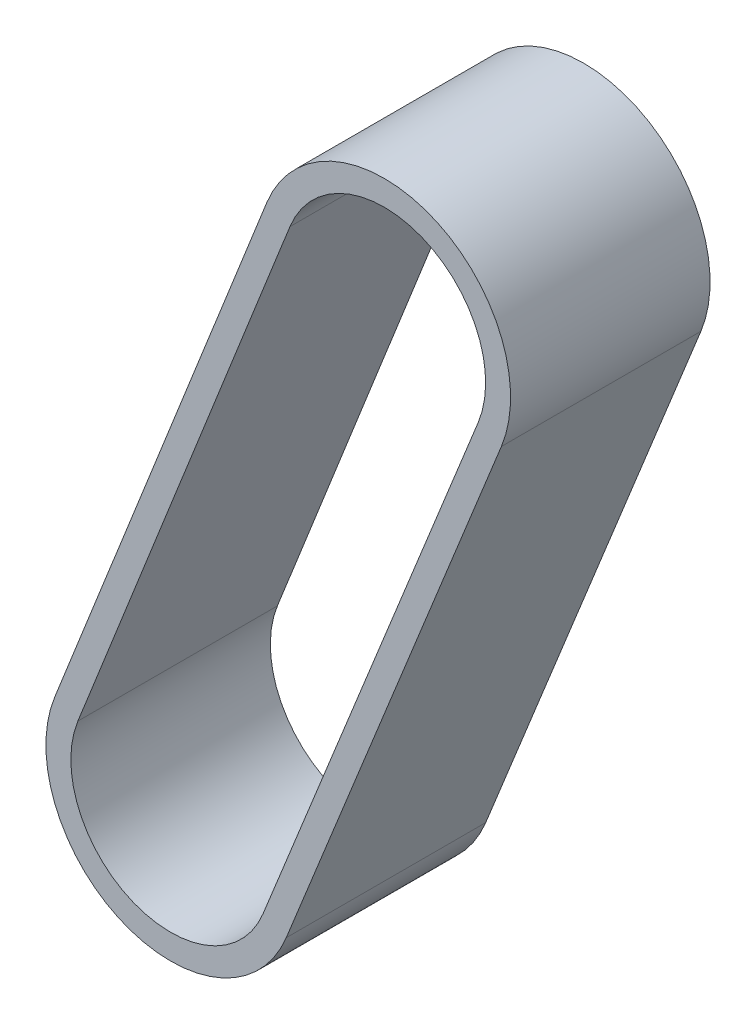
ISO-10303-21;
HEADER;
FILE_DESCRIPTION(('STEP AP214'),'2;1');
FILE_NAME('part.step','',(''),(''),'','','');
FILE_SCHEMA(('AUTOMOTIVE_DESIGN { 1 0 10303 214 1 1 1 1 }'));
ENDSEC;
DATA;
#1=APPLICATION_CONTEXT('core data for automotive mechanical design processes');
#2=APPLICATION_PROTOCOL_DEFINITION('international standard','automotive_design',2000,#1);
#3=PRODUCT_CONTEXT('',#1,'mechanical');
#4=PRODUCT('Part','Part','',(#3));
#5=PRODUCT_RELATED_PRODUCT_CATEGORY('part','',(#4));
#6=PRODUCT_DEFINITION_FORMATION('','',#4);
#7=PRODUCT_DEFINITION_CONTEXT('part definition',#1,'design');
#8=PRODUCT_DEFINITION('design','',#6,#7);
#9=PRODUCT_DEFINITION_SHAPE('','',#8);
#10=(LENGTH_UNIT() NAMED_UNIT(*) SI_UNIT(.MILLI.,.METRE.));
#11=(NAMED_UNIT(*) PLANE_ANGLE_UNIT() SI_UNIT($,.RADIAN.));
#12=(NAMED_UNIT(*) SI_UNIT($,.STERADIAN.) SOLID_ANGLE_UNIT());
#13=UNCERTAINTY_MEASURE_WITH_UNIT(LENGTH_MEASURE(1.E-05),#10,'distance_accuracy_value','');
#14=(GEOMETRIC_REPRESENTATION_CONTEXT(3) GLOBAL_UNCERTAINTY_ASSIGNED_CONTEXT((#13)) GLOBAL_UNIT_ASSIGNED_CONTEXT((#10,
#11,#12)) REPRESENTATION_CONTEXT('',''));
#15=CARTESIAN_POINT('',(0.,0.,0.));
#16=DIRECTION('',(0.,0.,1.));
#17=DIRECTION('',(1.,0.,0.));
#18=AXIS2_PLACEMENT_3D('',#15,#16,#17);
#19=CARTESIAN_POINT('',(-312.556104691908,126.162932863253,-3.00000000000024));
#20=DIRECTION('',(0.927305329792492,-0.374305791216805,0.));
#21=DIRECTION('',(0.374305791216805,0.927305329792492,0.));
#22=AXIS2_PLACEMENT_3D('',#19,#20,#21);
#23=PLANE('',#22);
#24=DIRECTION('',(0.374305791216805,0.927305329792492,0.));
#25=VECTOR('',#24,1.);
#26=CARTESIAN_POINT('',(-312.556104691908,126.162932863253,8.99999999999976));
#27=LINE('',#26,#25);
#28=CARTESIAN_POINT('',(-366.794500886047,-8.2072934341261,8.99999999999976));
#29=VERTEX_POINT('',#28);
#30=CARTESIAN_POINT('',(-353.852479493577,23.8552759867522,8.99999999999976));
#31=VERTEX_POINT('',#30);
#32=EDGE_CURVE('E144',#29,#31,#27,.T.);
#33=ORIENTED_EDGE('',*,*,#32,.F.);
#34=DIRECTION('',(0.,0.,1.));
#35=VECTOR('',#34,1.);
#36=CARTESIAN_POINT('',(-366.794500886047,-8.2072934341261,-3.00000000000024));
#37=LINE('',#36,#35);
#38=CARTESIAN_POINT('',(-366.794500886047,-8.2072934341261,-3.00000000000024));
#39=VERTEX_POINT('',#38);
#40=EDGE_CURVE('E11',#39,#29,#37,.T.);
#41=ORIENTED_EDGE('',*,*,#40,.F.);
#42=DIRECTION('',(0.374305791216805,0.927305329792492,0.));
#43=VECTOR('',#42,1.);
#44=CARTESIAN_POINT('',(-312.556104691908,126.162932863253,-3.00000000000024));
#45=LINE('',#44,#43);
#46=CARTESIAN_POINT('',(-353.852479493577,23.8552759867522,-3.00000000000024));
#47=VERTEX_POINT('',#46);
#48=EDGE_CURVE('E128',#39,#47,#45,.T.);
#49=ORIENTED_EDGE('',*,*,#48,.T.);
#50=DIRECTION('',(0.,0.,1.));
#51=VECTOR('',#50,1.);
#52=CARTESIAN_POINT('',(-353.852479493577,23.8552759867522,-3.00000000000024));
#53=LINE('',#52,#51);
#54=EDGE_CURVE('E119',#47,#31,#53,.T.);
#55=ORIENTED_EDGE('',*,*,#54,.T.);
#56=EDGE_LOOP('',(#33,#41,#49,#55));
#57=FACE_BOUND('',#56,.T.);
#58=ADVANCED_FACE('F38',(#57),#23,.T.);
#59=CARTESIAN_POINT('',(-373.74929085949,-5.40000000000007,-3.00000000000024));
#60=DIRECTION('',(0.,0.,1.));
#61=DIRECTION('',(1.,0.,0.));
#62=AXIS2_PLACEMENT_3D('',#59,#60,#61);
#63=CYLINDRICAL_SURFACE('',#62,7.50000000000001);
#64=CARTESIAN_POINT('',(-373.74929085949,-5.40000000000007,8.99999999999976));
#65=DIRECTION('',(0.,0.,1.));
#66=DIRECTION('',(1.,0.,0.));
#67=AXIS2_PLACEMENT_3D('',#64,#65,#66);
#68=CIRCLE('',#67,7.50000000000001);
#69=CARTESIAN_POINT('',(-380.720202711763,-2.63298212007113,8.99999999999976));
#70=VERTEX_POINT('',#69);
#71=EDGE_CURVE('E150',#70,#29,#68,.T.);
#72=ORIENTED_EDGE('',*,*,#71,.F.);
#73=DIRECTION('',(0.,0.,1.));
#74=VECTOR('',#73,1.);
#75=CARTESIAN_POINT('',(-380.720202711763,-2.63298212007113,-3.00000000000024));
#76=LINE('',#75,#74);
#77=CARTESIAN_POINT('',(-380.720202711763,-2.63298212007113,-3.00000000000024));
#78=VERTEX_POINT('',#77);
#79=EDGE_CURVE('E48',#78,#70,#76,.T.);
#80=ORIENTED_EDGE('',*,*,#79,.F.);
#81=CARTESIAN_POINT('',(-373.74929085949,-5.40000000000007,-3.00000000000024));
#82=DIRECTION('',(0.,0.,1.));
#83=DIRECTION('',(1.,0.,0.));
#84=AXIS2_PLACEMENT_3D('',#81,#82,#83);
#85=CIRCLE('',#84,7.50000000000001);
#86=EDGE_CURVE('E125',#78,#39,#85,.T.);
#87=ORIENTED_EDGE('',*,*,#86,.T.);
#88=ORIENTED_EDGE('',*,*,#40,.T.);
#89=EDGE_LOOP('',(#72,#80,#87,#88));
#90=FACE_BOUND('',#89,.T.);
#91=ADVANCED_FACE('F194',(#90),#63,.T.);
#92=CARTESIAN_POINT('',(-327.996145648299,130.194043303065,-3.00000000000024));
#93=DIRECTION('',(-0.929454913636337,0.368935717323858,0.));
#94=DIRECTION('',(-0.368935717323858,-0.929454913636337,0.));
#95=AXIS2_PLACEMENT_3D('',#92,#93,#94);
#96=PLANE('',#95);
#97=DIRECTION('',(-0.368935717323858,-0.929454913636337,0.));
#98=VECTOR('',#97,1.);
#99=CARTESIAN_POINT('',(-327.996145648299,130.194043303065,8.99999999999976));
#100=LINE('',#99,#98);
#101=CARTESIAN_POINT('',(-367.963857343636,29.5039114516613,8.99999999999976));
#102=VERTEX_POINT('',#101);
#103=EDGE_CURVE('E114',#102,#70,#100,.T.);
#104=ORIENTED_EDGE('',*,*,#103,.F.);
#105=DIRECTION('',(0.,0.,1.));
#106=VECTOR('',#105,1.);
#107=CARTESIAN_POINT('',(-367.963857343636,29.5039114516613,-3.00000000000024));
#108=LINE('',#107,#106);
#109=CARTESIAN_POINT('',(-367.963857343636,29.5039114516613,-3.00000000000024));
#110=VERTEX_POINT('',#109);
#111=EDGE_CURVE('E109',#110,#102,#108,.T.);
#112=ORIENTED_EDGE('',*,*,#111,.F.);
#113=DIRECTION('',(-0.368935717323858,-0.929454913636337,0.));
#114=VECTOR('',#113,1.);
#115=CARTESIAN_POINT('',(-327.996145648299,130.194043303065,-3.00000000000024));
#116=LINE('',#115,#114);
#117=EDGE_CURVE('E112',#110,#78,#116,.T.);
#118=ORIENTED_EDGE('',*,*,#117,.T.);
#119=ORIENTED_EDGE('',*,*,#79,.T.);
#120=EDGE_LOOP('',(#104,#112,#118,#119));
#121=FACE_BOUND('',#120,.T.);
#122=ADVANCED_FACE('F111',(#121),#96,.T.);
#123=CARTESIAN_POINT('',(-373.74929085949,-5.40000000000007,-3.00000000000024));
#124=DIRECTION('',(0.,0.,1.));
#125=DIRECTION('',(1.,0.,0.));
#126=AXIS2_PLACEMENT_3D('',#123,#124,#125);
#127=CYLINDRICAL_SURFACE('',#126,6.00000000000002);
#128=CARTESIAN_POINT('',(-373.74929085949,-5.40000000000007,8.99999999999976));
#129=DIRECTION('',(0.,0.,1.));
#130=DIRECTION('',(1.,0.,0.));
#131=AXIS2_PLACEMENT_3D('',#128,#129,#130);
#132=CIRCLE('',#131,6.00000000000002);
#133=CARTESIAN_POINT('',(-379.326020341309,-3.18638569605689,8.99999999999976));
#134=VERTEX_POINT('',#133);
#135=CARTESIAN_POINT('',(-368.185458880735,-7.64583474730088,8.99999999999976));
#136=VERTEX_POINT('',#135);
#137=EDGE_CURVE('E135',#134,#136,#132,.T.);
#138=ORIENTED_EDGE('',*,*,#137,.T.);
#139=DIRECTION('',(0.,0.,1.));
#140=VECTOR('',#139,1.);
#141=CARTESIAN_POINT('',(-368.185458880735,-7.64583474730088,-3.00000000000024));
#142=LINE('',#141,#140);
#143=CARTESIAN_POINT('',(-368.185458880735,-7.64583474730088,-3.00000000000024));
#144=VERTEX_POINT('',#143);
#145=EDGE_CURVE('E156',#144,#136,#142,.T.);
#146=ORIENTED_EDGE('',*,*,#145,.F.);
#147=CARTESIAN_POINT('',(-373.74929085949,-5.40000000000007,-3.00000000000024));
#148=DIRECTION('',(0.,0.,1.));
#149=DIRECTION('',(1.,0.,0.));
#150=AXIS2_PLACEMENT_3D('',#147,#148,#149);
#151=CIRCLE('',#150,6.00000000000002);
#152=CARTESIAN_POINT('',(-379.326020341309,-3.18638569605689,-3.00000000000024));
#153=VERTEX_POINT('',#152);
#154=EDGE_CURVE('E152',#153,#144,#151,.T.);
#155=ORIENTED_EDGE('',*,*,#154,.F.);
#156=DIRECTION('',(0.,0.,1.));
#157=VECTOR('',#156,1.);
#158=CARTESIAN_POINT('',(-379.326020341309,-3.18638569605689,-3.00000000000024));
#159=LINE('',#158,#157);
#160=EDGE_CURVE('E42',#153,#134,#159,.T.);
#161=ORIENTED_EDGE('',*,*,#160,.T.);
#162=EDGE_LOOP('',(#138,#146,#155,#161));
#163=FACE_BOUND('',#162,.T.);
#164=ADVANCED_FACE('F40',(#163),#127,.F.);
#165=CARTESIAN_POINT('',(-313.947062686597,126.724391550078,-3.00000000000024));
#166=DIRECTION('',(0.927305329792492,-0.374305791216805,0.));
#167=DIRECTION('',(0.374305791216805,0.927305329792492,0.));
#168=AXIS2_PLACEMENT_3D('',#165,#166,#167);
#169=PLANE('',#168);
#170=DIRECTION('',(0.374305791216805,0.927305329792492,0.));
#171=VECTOR('',#170,1.);
#172=CARTESIAN_POINT('',(-313.947062686597,126.724391550078,8.99999999999976));
#173=LINE('',#172,#171);
#174=CARTESIAN_POINT('',(-355.243437488266,24.4167346735775,8.99999999999976));
#175=VERTEX_POINT('',#174);
#176=EDGE_CURVE('E142',#136,#175,#173,.T.);
#177=ORIENTED_EDGE('',*,*,#176,.T.);
#178=DIRECTION('',(0.,0.,1.));
#179=VECTOR('',#178,1.);
#180=CARTESIAN_POINT('',(-355.243437488266,24.4167346735775,-3.00000000000024));
#181=LINE('',#180,#179);
#182=CARTESIAN_POINT('',(-355.243437488266,24.4167346735775,-3.00000000000024));
#183=VERTEX_POINT('',#182);
#184=EDGE_CURVE('E159',#183,#175,#181,.T.);
#185=ORIENTED_EDGE('',*,*,#184,.F.);
#186=DIRECTION('',(0.374305791216805,0.927305329792492,0.));
#187=VECTOR('',#186,1.);
#188=CARTESIAN_POINT('',(-313.947062686597,126.724391550078,-3.00000000000024));
#189=LINE('',#188,#187);
#190=EDGE_CURVE('E130',#144,#183,#189,.T.);
#191=ORIENTED_EDGE('',*,*,#190,.F.);
#192=ORIENTED_EDGE('',*,*,#145,.T.);
#193=EDGE_LOOP('',(#177,#185,#191,#192));
#194=FACE_BOUND('',#193,.T.);
#195=ADVANCED_FACE('F177',(#194),#169,.F.);
#196=CARTESIAN_POINT('',(-360.9,26.6999999999999,-3.00000000000024));
#197=DIRECTION('',(0.,0.,1.));
#198=DIRECTION('',(1.,0.,0.));
#199=AXIS2_PLACEMENT_3D('',#196,#197,#198);
#200=CYLINDRICAL_SURFACE('',#199,6.10000000000002);
#201=CARTESIAN_POINT('',(-360.9,26.6999999999999,8.99999999999976));
#202=DIRECTION('',(0.,0.,1.));
#203=DIRECTION('',(1.,0.,0.));
#204=AXIS2_PLACEMENT_3D('',#201,#202,#203);
#205=CIRCLE('',#204,6.10000000000002);
#206=CARTESIAN_POINT('',(-366.569674973182,28.9505078756755,8.99999999999976));
#207=VERTEX_POINT('',#206);
#208=EDGE_CURVE('E140',#175,#207,#205,.T.);
#209=ORIENTED_EDGE('',*,*,#208,.T.);
#210=DIRECTION('',(0.,0.,1.));
#211=VECTOR('',#210,1.);
#212=CARTESIAN_POINT('',(-366.569674973182,28.9505078756755,-3.00000000000024));
#213=LINE('',#212,#211);
#214=CARTESIAN_POINT('',(-366.569674973182,28.9505078756755,-3.00000000000024));
#215=VERTEX_POINT('',#214);
#216=EDGE_CURVE('E161',#215,#207,#213,.T.);
#217=ORIENTED_EDGE('',*,*,#216,.F.);
#218=CARTESIAN_POINT('',(-360.9,26.6999999999999,-3.00000000000024));
#219=DIRECTION('',(0.,0.,1.));
#220=DIRECTION('',(1.,0.,0.));
#221=AXIS2_PLACEMENT_3D('',#218,#219,#220);
#222=CIRCLE('',#221,6.10000000000002);
#223=EDGE_CURVE('E179',#183,#215,#222,.T.);
#224=ORIENTED_EDGE('',*,*,#223,.F.);
#225=ORIENTED_EDGE('',*,*,#184,.T.);
#226=EDGE_LOOP('',(#209,#217,#224,#225));
#227=FACE_BOUND('',#226,.T.);
#228=ADVANCED_FACE('F184',(#227),#200,.F.);
#229=CARTESIAN_POINT('',(-326.601963277845,129.640639727079,-3.00000000000024));
#230=DIRECTION('',(-0.929454913636337,0.368935717323858,0.));
#231=DIRECTION('',(-0.368935717323858,-0.929454913636337,0.));
#232=AXIS2_PLACEMENT_3D('',#229,#230,#231);
#233=PLANE('',#232);
#234=DIRECTION('',(-0.368935717323858,-0.929454913636337,0.));
#235=VECTOR('',#234,1.);
#236=CARTESIAN_POINT('',(-326.601963277845,129.640639727079,8.99999999999976));
#237=LINE('',#236,#235);
#238=EDGE_CURVE('E138',#207,#134,#237,.T.);
#239=ORIENTED_EDGE('',*,*,#238,.T.);
#240=ORIENTED_EDGE('',*,*,#160,.F.);
#241=DIRECTION('',(-0.368935717323858,-0.929454913636337,0.));
#242=VECTOR('',#241,1.);
#243=CARTESIAN_POINT('',(-326.601963277845,129.640639727079,-3.00000000000024));
#244=LINE('',#243,#242);
#245=EDGE_CURVE('E96',#215,#153,#244,.T.);
#246=ORIENTED_EDGE('',*,*,#245,.F.);
#247=ORIENTED_EDGE('',*,*,#216,.T.);
#248=EDGE_LOOP('',(#239,#240,#246,#247));
#249=FACE_BOUND('',#248,.T.);
#250=ADVANCED_FACE('F185',(#249),#233,.F.);
#251=CARTESIAN_POINT('',(-360.9,26.6999999999999,-3.00000000000024));
#252=DIRECTION('',(0.,0.,1.));
#253=DIRECTION('',(1.,0.,0.));
#254=AXIS2_PLACEMENT_3D('',#251,#252,#253);
#255=CYLINDRICAL_SURFACE('',#254,7.60000000000001);
#256=CARTESIAN_POINT('',(-360.9,26.6999999999999,8.99999999999976));
#257=DIRECTION('',(0.,0.,1.));
#258=DIRECTION('',(1.,0.,0.));
#259=AXIS2_PLACEMENT_3D('',#256,#257,#258);
#260=CIRCLE('',#259,7.60000000000001);
#261=EDGE_CURVE('E147',#31,#102,#260,.T.);
#262=ORIENTED_EDGE('',*,*,#261,.F.);
#263=ORIENTED_EDGE('',*,*,#54,.F.);
#264=CARTESIAN_POINT('',(-360.9,26.6999999999999,-3.00000000000024));
#265=DIRECTION('',(0.,0.,1.));
#266=DIRECTION('',(1.,0.,0.));
#267=AXIS2_PLACEMENT_3D('',#264,#265,#266);
#268=CIRCLE('',#267,7.60000000000001);
#269=EDGE_CURVE('E124',#47,#110,#268,.T.);
#270=ORIENTED_EDGE('',*,*,#269,.T.);
#271=ORIENTED_EDGE('',*,*,#111,.T.);
#272=EDGE_LOOP('',(#262,#263,#270,#271));
#273=FACE_BOUND('',#272,.T.);
#274=ADVANCED_FACE('F127',(#273),#255,.T.);
#275=CARTESIAN_POINT('',(0.,0.,-3.00000000000024));
#276=DIRECTION('',(0.,0.,1.));
#277=DIRECTION('',(1.,0.,0.));
#278=AXIS2_PLACEMENT_3D('',#275,#276,#277);
#279=PLANE('',#278);
#280=ORIENTED_EDGE('',*,*,#154,.T.);
#281=ORIENTED_EDGE('',*,*,#190,.T.);
#282=ORIENTED_EDGE('',*,*,#223,.T.);
#283=ORIENTED_EDGE('',*,*,#245,.T.);
#284=EDGE_LOOP('',(#280,#281,#282,#283));
#285=FACE_BOUND('',#284,.T.);
#286=ORIENTED_EDGE('',*,*,#48,.F.);
#287=ORIENTED_EDGE('',*,*,#86,.F.);
#288=ORIENTED_EDGE('',*,*,#117,.F.);
#289=ORIENTED_EDGE('',*,*,#269,.F.);
#290=EDGE_LOOP('',(#286,#287,#288,#289));
#291=FACE_BOUND('',#290,.T.);
#292=ADVANCED_FACE('F123',(#285,#291),#279,.F.);
#293=CARTESIAN_POINT('',(0.,0.,8.99999999999976));
#294=DIRECTION('',(0.,0.,1.));
#295=DIRECTION('',(1.,0.,0.));
#296=AXIS2_PLACEMENT_3D('',#293,#294,#295);
#297=PLANE('',#296);
#298=ORIENTED_EDGE('',*,*,#137,.F.);
#299=ORIENTED_EDGE('',*,*,#238,.F.);
#300=ORIENTED_EDGE('',*,*,#208,.F.);
#301=ORIENTED_EDGE('',*,*,#176,.F.);
#302=EDGE_LOOP('',(#298,#299,#300,#301));
#303=FACE_BOUND('',#302,.T.);
#304=ORIENTED_EDGE('',*,*,#32,.T.);
#305=ORIENTED_EDGE('',*,*,#261,.T.);
#306=ORIENTED_EDGE('',*,*,#103,.T.);
#307=ORIENTED_EDGE('',*,*,#71,.T.);
#308=EDGE_LOOP('',(#304,#305,#306,#307));
#309=FACE_BOUND('',#308,.T.);
#310=ADVANCED_FACE('F172',(#303,#309),#297,.T.);
#311=CLOSED_SHELL('',(#58,#91,#122,#164,#195,#228,#250,#274,#292,#310));
#312=MANIFOLD_SOLID_BREP('B2',#311);
#313=ADVANCED_BREP_SHAPE_REPRESENTATION('',(#18,#312),#14);
#314=SHAPE_DEFINITION_REPRESENTATION(#9,#313);
ENDSEC;
END-ISO-10303-21;
